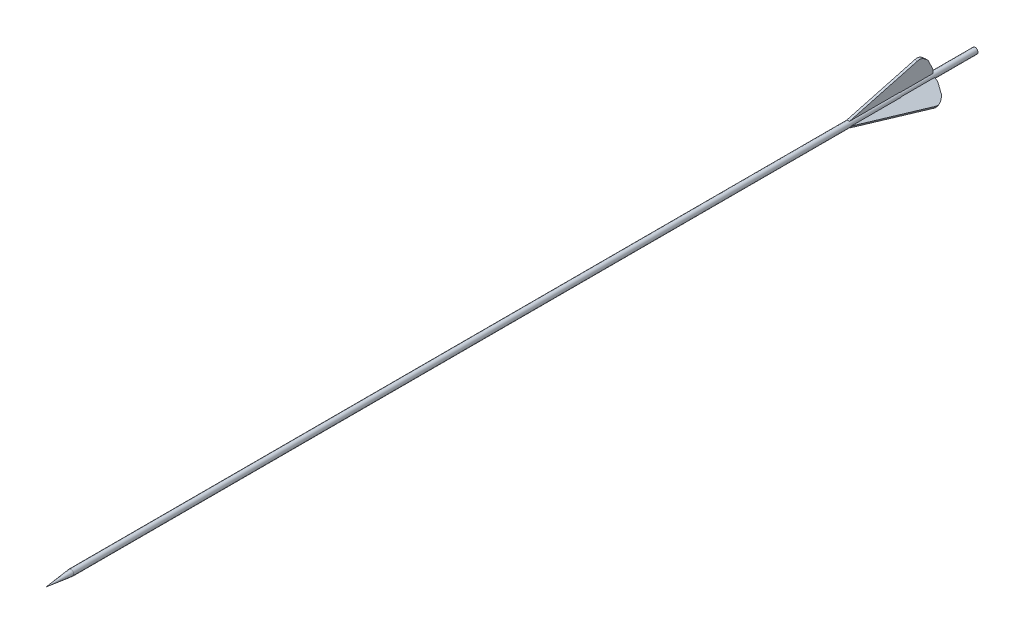
ISO-10303-21;
HEADER;
FILE_DESCRIPTION(('STEP AP214'),'2;1');
FILE_NAME('part.step','',(''),(''),'','','');
FILE_SCHEMA(('AUTOMOTIVE_DESIGN { 1 0 10303 214 1 1 1 1 }'));
ENDSEC;
DATA;
#1=APPLICATION_CONTEXT('core data for automotive mechanical design processes');
#2=APPLICATION_PROTOCOL_DEFINITION('international standard','automotive_design',2000,#1);
#3=PRODUCT_CONTEXT('',#1,'mechanical');
#4=PRODUCT('Part','Part','',(#3));
#5=PRODUCT_RELATED_PRODUCT_CATEGORY('part','',(#4));
#6=PRODUCT_DEFINITION_FORMATION('','',#4);
#7=PRODUCT_DEFINITION_CONTEXT('part definition',#1,'design');
#8=PRODUCT_DEFINITION('design','',#6,#7);
#9=PRODUCT_DEFINITION_SHAPE('','',#8);
#10=(LENGTH_UNIT() NAMED_UNIT(*) SI_UNIT(.MILLI.,.METRE.));
#11=(NAMED_UNIT(*) PLANE_ANGLE_UNIT() SI_UNIT($,.RADIAN.));
#12=(NAMED_UNIT(*) SI_UNIT($,.STERADIAN.) SOLID_ANGLE_UNIT());
#13=UNCERTAINTY_MEASURE_WITH_UNIT(LENGTH_MEASURE(1.E-05),#10,'distance_accuracy_value','');
#14=(GEOMETRIC_REPRESENTATION_CONTEXT(3) GLOBAL_UNCERTAINTY_ASSIGNED_CONTEXT((#13)) GLOBAL_UNIT_ASSIGNED_CONTEXT((#10,
#11,#12)) REPRESENTATION_CONTEXT('',''));
#15=CARTESIAN_POINT('',(0.,0.,0.));
#16=DIRECTION('',(0.,0.,1.));
#17=DIRECTION('',(1.,0.,0.));
#18=AXIS2_PLACEMENT_3D('',#15,#16,#17);
#19=CARTESIAN_POINT('',(1.435739982539,-1.98362540378443,-265.851898490184));
#20=DIRECTION('',(-0.836516303737814,0.482962913144527,-0.258819045102514));
#21=DIRECTION('',(0.224143868042009,-0.129409522551255,-0.96592582628907));
#22=AXIS2_PLACEMENT_3D('',#19,#20,#21);
#23=PLANE('',#22);
#24=DIRECTION('',(-0.224143868042009,0.129409522551255,0.96592582628907));
#25=VECTOR('',#24,1.);
#26=CARTESIAN_POINT('',(2.43573998253898,-0.251574596215539,-265.851898490184));
#27=LINE('',#26,#25);
#28=CARTESIAN_POINT('',(14.8705869414842,-7.43083683529418,-319.438641364391));
#29=VERTEX_POINT('',#28);
#30=CARTESIAN_POINT('',(2.43573998253898,-0.251574596215539,-265.851898490184));
#31=VERTEX_POINT('',#30);
#32=EDGE_CURVE('E131',#29,#31,#27,.T.);
#33=ORIENTED_EDGE('',*,*,#32,.T.);
#34=DIRECTION('',(0.499999999999992,0.866025403784443,0.));
#35=VECTOR('',#34,1.);
#36=CARTESIAN_POINT('',(1.435739982539,-1.98362540378443,-265.851898490184));
#37=LINE('',#36,#35);
#38=CARTESIAN_POINT('',(1.435739982539,-1.98362540378443,-265.851898490184));
#39=VERTEX_POINT('',#38);
#40=EDGE_CURVE('E12',#39,#31,#37,.T.);
#41=ORIENTED_EDGE('',*,*,#40,.F.);
#42=DIRECTION('',(-0.224143868042009,0.129409522551255,0.96592582628907));
#43=VECTOR('',#42,1.);
#44=CARTESIAN_POINT('',(1.435739982539,-1.98362540378443,-265.851898490184));
#45=LINE('',#44,#43);
#46=CARTESIAN_POINT('',(13.8705869414842,-9.16288764286307,-319.438641364391));
#47=VERTEX_POINT('',#46);
#48=EDGE_CURVE('E99',#47,#39,#45,.T.);
#49=ORIENTED_EDGE('',*,*,#48,.F.);
#50=DIRECTION('',(0.499999999999992,0.866025403784443,0.));
#51=VECTOR('',#50,1.);
#52=CARTESIAN_POINT('',(13.8705869414842,-9.16288764286307,-319.438641364391));
#53=LINE('',#52,#51);
#54=EDGE_CURVE('E107',#47,#29,#53,.T.);
#55=ORIENTED_EDGE('',*,*,#54,.T.);
#56=EDGE_LOOP('',(#33,#41,#49,#55));
#57=FACE_BOUND('',#56,.T.);
#58=ADVANCED_FACE('F48',(#57),#23,.F.);
#59=CARTESIAN_POINT('',(1.435739982539,-1.98362540378443,-304.595078033719));
#60=DIRECTION('',(0.866025403784443,-0.499999999999992,0.));
#61=DIRECTION('',(0.,0.,1.));
#62=AXIS2_PLACEMENT_3D('',#59,#60,#61);
#63=PLANE('',#62);
#64=DIRECTION('',(0.,0.,-1.));
#65=VECTOR('',#64,1.);
#66=CARTESIAN_POINT('',(2.43573998253898,-0.251574596215539,-304.595078033719));
#67=LINE('',#66,#65);
#68=CARTESIAN_POINT('',(2.43573998253898,-0.251574596215539,-304.595078033719));
#69=VERTEX_POINT('',#68);
#70=EDGE_CURVE('E103',#31,#69,#67,.T.);
#71=ORIENTED_EDGE('',*,*,#70,.T.);
#72=DIRECTION('',(0.499999999999992,0.866025403784443,0.));
#73=VECTOR('',#72,1.);
#74=CARTESIAN_POINT('',(1.435739982539,-1.98362540378443,-304.595078033719));
#75=LINE('',#74,#73);
#76=CARTESIAN_POINT('',(1.435739982539,-1.98362540378443,-304.595078033719));
#77=VERTEX_POINT('',#76);
#78=EDGE_CURVE('E56',#77,#69,#75,.T.);
#79=ORIENTED_EDGE('',*,*,#78,.F.);
#80=DIRECTION('',(0.,0.,-1.));
#81=VECTOR('',#80,1.);
#82=CARTESIAN_POINT('',(1.435739982539,-1.98362540378443,-304.595078033719));
#83=LINE('',#82,#81);
#84=EDGE_CURVE('E94',#39,#77,#83,.T.);
#85=ORIENTED_EDGE('',*,*,#84,.F.);
#86=ORIENTED_EDGE('',*,*,#40,.T.);
#87=EDGE_LOOP('',(#71,#79,#85,#86));
#88=FACE_BOUND('',#87,.T.);
#89=ADVANCED_FACE('F102',(#88),#63,.F.);
#90=CARTESIAN_POINT('',(1.435739982539,-1.98362540378443,-304.595078033719));
#91=CARTESIAN_POINT('',(-0.435244171583323,-0.903412198752403,-317.618960327838));
#92=CARTESIAN_POINT('',(-3.70285376285361,0.98314307837406,-336.834434554968));
#93=CARTESIAN_POINT('',(11.5102699142412,-7.80015797181151,-326.789941802017));
#94=CARTESIAN_POINT('',(9.79163328500009,-6.80790265128003,-329.183734976983));
#95=CARTESIAN_POINT('',(12.8891765999051,-8.59627011796695,-324.768164308936));
#96=B_SPLINE_CURVE_WITH_KNOTS('',3,(#90,#91,#92,#93,#94,#95),.UNSPECIFIED.,.F.,.F.,(4,1,1,4),
(0.,0.505374178056224,0.593785367664236,0.884111896080116),.UNSPECIFIED.);
#97=DIRECTION('',(0.499999999999992,0.866025403784443,0.));
#98=VECTOR('',#97,1.);
#99=SURFACE_OF_LINEAR_EXTRUSION('',#96,#98);
#100=CARTESIAN_POINT('',(2.43573998253898,-0.251574596215539,-304.595078033719));
#101=CARTESIAN_POINT('',(0.564755828416661,0.828638608816483,-317.618960327838));
#102=CARTESIAN_POINT('',(-2.70285376285363,2.71519388594295,-336.834434554968));
#103=CARTESIAN_POINT('',(12.5102699142412,-6.06810716424262,-326.789941802017));
#104=CARTESIAN_POINT('',(10.7916332850001,-5.07585184371114,-329.183734976983));
#105=CARTESIAN_POINT('',(13.8891765999051,-6.86421931039806,-324.768164308936));
#106=B_SPLINE_CURVE_WITH_KNOTS('',3,(#100,#101,#102,#103,#104,#105),.UNSPECIFIED.,.F.,.F.,(4,1,
1,4),(0.,0.505374178056224,0.593785367664236,0.884111896080116),.UNSPECIFIED.);
#107=CARTESIAN_POINT('',(13.8891765999051,-6.86421931039806,-324.768164308936));
#108=VERTEX_POINT('',#107);
#109=EDGE_CURVE('E81',#69,#108,#106,.T.);
#110=ORIENTED_EDGE('',*,*,#109,.T.);
#111=DIRECTION('',(0.499999999999992,0.866025403784443,0.));
#112=VECTOR('',#111,1.);
#113=CARTESIAN_POINT('',(12.8891765999051,-8.59627011796695,-324.768164308936));
#114=LINE('',#113,#112);
#115=CARTESIAN_POINT('',(12.8891765999051,-8.59627011796695,-324.768164308936));
#116=VERTEX_POINT('',#115);
#117=EDGE_CURVE('E104',#116,#108,#114,.T.);
#118=ORIENTED_EDGE('',*,*,#117,.F.);
#119=EDGE_CURVE('E97',#77,#116,#96,.T.);
#120=ORIENTED_EDGE('',*,*,#119,.F.);
#121=ORIENTED_EDGE('',*,*,#78,.T.);
#122=EDGE_LOOP('',(#110,#118,#120,#121));
#123=FACE_BOUND('',#122,.T.);
#124=ADVANCED_FACE('F105',(#123),#99,.F.);
#125=CARTESIAN_POINT('',(8.85148911905731,-6.26511016399592,-320.991555635006));
#126=DIRECTION('',(0.499999999999992,0.866025403784443,0.));
#127=DIRECTION('',(0.,0.,1.));
#128=AXIS2_PLACEMENT_3D('',#125,#126,#127);
#129=CYLINDRICAL_SURFACE('',#128,5.99999999999999);
#130=CARTESIAN_POINT('',(9.85148911905729,-4.53305935642703,-320.991555635006));
#131=DIRECTION('',(-0.499999999999992,-0.866025403784443,0.));
#132=DIRECTION('',(0.,0.,-1.));
#133=AXIS2_PLACEMENT_3D('',#130,#131,#132);
#134=CIRCLE('',#133,5.99999999999999);
#135=EDGE_CURVE('E87',#108,#29,#134,.T.);
#136=ORIENTED_EDGE('',*,*,#135,.T.);
#137=ORIENTED_EDGE('',*,*,#54,.F.);
#138=CARTESIAN_POINT('',(8.85148911905731,-6.26511016399592,-320.991555635006));
#139=DIRECTION('',(-0.499999999999992,-0.866025403784443,0.));
#140=DIRECTION('',(0.,0.,-1.));
#141=AXIS2_PLACEMENT_3D('',#138,#139,#140);
#142=CIRCLE('',#141,5.99999999999999);
#143=EDGE_CURVE('E64',#116,#47,#142,.T.);
#144=ORIENTED_EDGE('',*,*,#143,.F.);
#145=ORIENTED_EDGE('',*,*,#117,.T.);
#146=EDGE_LOOP('',(#136,#137,#144,#145));
#147=FACE_BOUND('',#146,.T.);
#148=ADVANCED_FACE('F120',(#147),#129,.T.);
#149=CARTESIAN_POINT('',(8.85148911905731,-6.26511016399592,-320.991555635006));
#150=DIRECTION('',(-0.499999999999992,-0.866025403784443,0.));
#151=DIRECTION('',(0.,0.,-1.));
#152=AXIS2_PLACEMENT_3D('',#149,#150,#151);
#153=PLANE('',#152);
#154=ORIENTED_EDGE('',*,*,#48,.T.);
#155=ORIENTED_EDGE('',*,*,#84,.T.);
#156=ORIENTED_EDGE('',*,*,#119,.T.);
#157=ORIENTED_EDGE('',*,*,#143,.T.);
#158=EDGE_LOOP('',(#154,#155,#156,#157));
#159=FACE_BOUND('',#158,.T.);
#160=ADVANCED_FACE('F95',(#159),#153,.T.);
#161=CARTESIAN_POINT('',(9.85148911905729,-4.53305935642703,-320.991555635006));
#162=DIRECTION('',(-0.499999999999992,-0.866025403784443,0.));
#163=DIRECTION('',(0.,0.,-1.));
#164=AXIS2_PLACEMENT_3D('',#161,#162,#163);
#165=PLANE('',#164);
#166=ORIENTED_EDGE('',*,*,#32,.F.);
#167=ORIENTED_EDGE('',*,*,#135,.F.);
#168=ORIENTED_EDGE('',*,*,#109,.F.);
#169=ORIENTED_EDGE('',*,*,#70,.F.);
#170=EDGE_LOOP('',(#166,#167,#168,#169));
#171=FACE_BOUND('',#170,.T.);
#172=ADVANCED_FACE('F143',(#171),#165,.F.);
#173=CLOSED_SHELL('',(#58,#89,#124,#148,#160,#172));
#174=MANIFOLD_SOLID_BREP('B2',#173);
#175=CARTESIAN_POINT('',(-2.43573998253898,-0.251574596215572,-265.851898490184));
#176=DIRECTION('',(0.836516303737807,0.482962913144539,-0.258819045102514));
#177=DIRECTION('',(-0.224143868042007,-0.129409522551258,-0.96592582628907));
#178=AXIS2_PLACEMENT_3D('',#175,#176,#177);
#179=PLANE('',#178);
#180=DIRECTION('',(0.224143868042007,0.129409522551258,0.96592582628907));
#181=VECTOR('',#180,1.);
#182=CARTESIAN_POINT('',(-1.43573998253897,-1.98362540378445,-265.851898490184));
#183=LINE('',#182,#181);
#184=CARTESIAN_POINT('',(-13.8705869414841,-9.16288764286326,-319.438641364391));
#185=VERTEX_POINT('',#184);
#186=CARTESIAN_POINT('',(-1.43573998253897,-1.98362540378445,-265.851898490184));
#187=VERTEX_POINT('',#186);
#188=EDGE_CURVE('E288',#185,#187,#183,.T.);
#189=ORIENTED_EDGE('',*,*,#188,.T.);
#190=DIRECTION('',(0.500000000000004,-0.866025403784436,0.));
#191=VECTOR('',#190,1.);
#192=CARTESIAN_POINT('',(-2.43573998253898,-0.251574596215572,-265.851898490184));
#193=LINE('',#192,#191);
#194=CARTESIAN_POINT('',(-2.43573998253898,-0.251574596215572,-265.851898490184));
#195=VERTEX_POINT('',#194);
#196=EDGE_CURVE('E46',#195,#187,#193,.T.);
#197=ORIENTED_EDGE('',*,*,#196,.F.);
#198=DIRECTION('',(0.224143868042007,0.129409522551258,0.96592582628907));
#199=VECTOR('',#198,1.);
#200=CARTESIAN_POINT('',(-2.43573998253898,-0.251574596215572,-265.851898490184));
#201=LINE('',#200,#199);
#202=CARTESIAN_POINT('',(-14.8705869414841,-7.43083683529439,-319.438641364391));
#203=VERTEX_POINT('',#202);
#204=EDGE_CURVE('E256',#203,#195,#201,.T.);
#205=ORIENTED_EDGE('',*,*,#204,.F.);
#206=DIRECTION('',(0.500000000000004,-0.866025403784436,0.));
#207=VECTOR('',#206,1.);
#208=CARTESIAN_POINT('',(-14.8705869414841,-7.43083683529439,-319.438641364391));
#209=LINE('',#208,#207);
#210=EDGE_CURVE('E264',#203,#185,#209,.T.);
#211=ORIENTED_EDGE('',*,*,#210,.T.);
#212=EDGE_LOOP('',(#189,#197,#205,#211));
#213=FACE_BOUND('',#212,.T.);
#214=ADVANCED_FACE('F205',(#213),#179,.F.);
#215=CARTESIAN_POINT('',(-2.43573998253898,-0.251574596215572,-304.595078033719));
#216=DIRECTION('',(-0.866025403784436,-0.500000000000004,0.));
#217=DIRECTION('',(0.,0.,1.));
#218=AXIS2_PLACEMENT_3D('',#215,#216,#217);
#219=PLANE('',#218);
#220=DIRECTION('',(0.,0.,-1.));
#221=VECTOR('',#220,1.);
#222=CARTESIAN_POINT('',(-1.43573998253897,-1.98362540378445,-304.595078033719));
#223=LINE('',#222,#221);
#224=CARTESIAN_POINT('',(-1.43573998253897,-1.98362540378445,-304.595078033719));
#225=VERTEX_POINT('',#224);
#226=EDGE_CURVE('E260',#187,#225,#223,.T.);
#227=ORIENTED_EDGE('',*,*,#226,.T.);
#228=DIRECTION('',(0.500000000000004,-0.866025403784436,0.));
#229=VECTOR('',#228,1.);
#230=CARTESIAN_POINT('',(-2.43573998253898,-0.251574596215572,-304.595078033719));
#231=LINE('',#230,#229);
#232=CARTESIAN_POINT('',(-2.43573998253898,-0.251574596215572,-304.595078033719));
#233=VERTEX_POINT('',#232);
#234=EDGE_CURVE('E213',#233,#225,#231,.T.);
#235=ORIENTED_EDGE('',*,*,#234,.F.);
#236=DIRECTION('',(0.,0.,-1.));
#237=VECTOR('',#236,1.);
#238=CARTESIAN_POINT('',(-2.43573998253898,-0.251574596215572,-304.595078033719));
#239=LINE('',#238,#237);
#240=EDGE_CURVE('E251',#195,#233,#239,.T.);
#241=ORIENTED_EDGE('',*,*,#240,.F.);
#242=ORIENTED_EDGE('',*,*,#196,.T.);
#243=EDGE_LOOP('',(#227,#235,#241,#242));
#244=FACE_BOUND('',#243,.T.);
#245=ADVANCED_FACE('F259',(#244),#219,.F.);
#246=CARTESIAN_POINT('',(-2.43573998253898,-0.251574596215572,-304.595078033719));
#247=CARTESIAN_POINT('',(-0.564755828416672,0.828638608816475,-317.618960327838));
#248=CARTESIAN_POINT('',(2.70285376285359,2.71519388594298,-336.834434554968));
#249=CARTESIAN_POINT('',(-12.5102699142411,-6.0681071642428,-326.789941802017));
#250=CARTESIAN_POINT('',(-10.791633285,-5.07585184371129,-329.183734976983));
#251=CARTESIAN_POINT('',(-13.889176599905,-6.86421931039825,-324.768164308936));
#252=B_SPLINE_CURVE_WITH_KNOTS('',3,(#246,#247,#248,#249,#250,#251),.UNSPECIFIED.,.F.,.F.,(4,1,
1,4),(0.,0.505374178056224,0.593785367664236,0.884111896080116),.UNSPECIFIED.);
#253=DIRECTION('',(0.500000000000004,-0.866025403784436,0.));
#254=VECTOR('',#253,1.);
#255=SURFACE_OF_LINEAR_EXTRUSION('',#252,#254);
#256=CARTESIAN_POINT('',(-1.43573998253897,-1.98362540378445,-304.595078033719));
#257=CARTESIAN_POINT('',(0.435244171583336,-0.903412198752398,-317.618960327838));
#258=CARTESIAN_POINT('',(3.7028537628536,0.983143078374111,-336.834434554968));
#259=CARTESIAN_POINT('',(-11.5102699142411,-7.80015797181167,-326.789941802017));
#260=CARTESIAN_POINT('',(-9.791633285,-6.80790265128016,-329.183734976983));
#261=CARTESIAN_POINT('',(-12.889176599905,-8.59627011796712,-324.768164308936));
#262=B_SPLINE_CURVE_WITH_KNOTS('',3,(#256,#257,#258,#259,#260,#261),.UNSPECIFIED.,.F.,.F.,(4,1,
1,4),(0.,0.505374178056224,0.593785367664236,0.884111896080116),.UNSPECIFIED.);
#263=CARTESIAN_POINT('',(-12.889176599905,-8.59627011796712,-324.768164308936));
#264=VERTEX_POINT('',#263);
#265=EDGE_CURVE('E238',#225,#264,#262,.T.);
#266=ORIENTED_EDGE('',*,*,#265,.T.);
#267=DIRECTION('',(0.500000000000004,-0.866025403784436,0.));
#268=VECTOR('',#267,1.);
#269=CARTESIAN_POINT('',(-13.889176599905,-6.86421931039825,-324.768164308936));
#270=LINE('',#269,#268);
#271=CARTESIAN_POINT('',(-13.889176599905,-6.86421931039825,-324.768164308936));
#272=VERTEX_POINT('',#271);
#273=EDGE_CURVE('E261',#272,#264,#270,.T.);
#274=ORIENTED_EDGE('',*,*,#273,.F.);
#275=EDGE_CURVE('E254',#233,#272,#252,.T.);
#276=ORIENTED_EDGE('',*,*,#275,.F.);
#277=ORIENTED_EDGE('',*,*,#234,.T.);
#278=EDGE_LOOP('',(#266,#274,#276,#277));
#279=FACE_BOUND('',#278,.T.);
#280=ADVANCED_FACE('F262',(#279),#255,.F.);
#281=CARTESIAN_POINT('',(-9.85148911905723,-4.53305935642717,-320.991555635006));
#282=DIRECTION('',(0.500000000000004,-0.866025403784436,0.));
#283=DIRECTION('',(0.,0.,1.));
#284=AXIS2_PLACEMENT_3D('',#281,#282,#283);
#285=CYLINDRICAL_SURFACE('',#284,5.99999999999999);
#286=CARTESIAN_POINT('',(-8.85148911905723,-6.26511016399604,-320.991555635006));
#287=DIRECTION('',(-0.500000000000004,0.866025403784436,0.));
#288=DIRECTION('',(0.,0.,-1.));
#289=AXIS2_PLACEMENT_3D('',#286,#287,#288);
#290=CIRCLE('',#289,5.99999999999999);
#291=EDGE_CURVE('E244',#264,#185,#290,.T.);
#292=ORIENTED_EDGE('',*,*,#291,.T.);
#293=ORIENTED_EDGE('',*,*,#210,.F.);
#294=CARTESIAN_POINT('',(-9.85148911905723,-4.53305935642717,-320.991555635006));
#295=DIRECTION('',(-0.500000000000004,0.866025403784436,0.));
#296=DIRECTION('',(0.,0.,-1.));
#297=AXIS2_PLACEMENT_3D('',#294,#295,#296);
#298=CIRCLE('',#297,5.99999999999999);
#299=EDGE_CURVE('E221',#272,#203,#298,.T.);
#300=ORIENTED_EDGE('',*,*,#299,.F.);
#301=ORIENTED_EDGE('',*,*,#273,.T.);
#302=EDGE_LOOP('',(#292,#293,#300,#301));
#303=FACE_BOUND('',#302,.T.);
#304=ADVANCED_FACE('F277',(#303),#285,.T.);
#305=CARTESIAN_POINT('',(-9.85148911905723,-4.53305935642717,-320.991555635006));
#306=DIRECTION('',(-0.500000000000004,0.866025403784436,0.));
#307=DIRECTION('',(0.,0.,-1.));
#308=AXIS2_PLACEMENT_3D('',#305,#306,#307);
#309=PLANE('',#308);
#310=ORIENTED_EDGE('',*,*,#204,.T.);
#311=ORIENTED_EDGE('',*,*,#240,.T.);
#312=ORIENTED_EDGE('',*,*,#275,.T.);
#313=ORIENTED_EDGE('',*,*,#299,.T.);
#314=EDGE_LOOP('',(#310,#311,#312,#313));
#315=FACE_BOUND('',#314,.T.);
#316=ADVANCED_FACE('F252',(#315),#309,.T.);
#317=CARTESIAN_POINT('',(-8.85148911905723,-6.26511016399604,-320.991555635006));
#318=DIRECTION('',(-0.500000000000004,0.866025403784436,0.));
#319=DIRECTION('',(0.,0.,-1.));
#320=AXIS2_PLACEMENT_3D('',#317,#318,#319);
#321=PLANE('',#320);
#322=ORIENTED_EDGE('',*,*,#188,.F.);
#323=ORIENTED_EDGE('',*,*,#291,.F.);
#324=ORIENTED_EDGE('',*,*,#265,.F.);
#325=ORIENTED_EDGE('',*,*,#226,.F.);
#326=EDGE_LOOP('',(#322,#323,#324,#325));
#327=FACE_BOUND('',#326,.T.);
#328=ADVANCED_FACE('F300',(#327),#321,.F.);
#329=CLOSED_SHELL('',(#214,#245,#280,#304,#316,#328));
#330=MANIFOLD_SOLID_BREP('B6',#329);
#331=CARTESIAN_POINT('',(1.,2.2352,-265.851898490184));
#332=DIRECTION('',(0.,-0.96592582628907,-0.258819045102514));
#333=DIRECTION('',(0.,0.258819045102514,-0.96592582628907));
#334=AXIS2_PLACEMENT_3D('',#331,#332,#333);
#335=PLANE('',#334);
#336=DIRECTION('',(0.,-0.258819045102514,0.96592582628907));
#337=VECTOR('',#336,1.);
#338=CARTESIAN_POINT('',(-1.,2.2352,-265.851898490184));
#339=LINE('',#338,#337);
#340=CARTESIAN_POINT('',(-1.,16.5937244781575,-319.438641364391));
#341=VERTEX_POINT('',#340);
#342=CARTESIAN_POINT('',(-1.,2.2352,-265.851898490184));
#343=VERTEX_POINT('',#342);
#344=EDGE_CURVE('E444',#341,#343,#339,.T.);
#345=ORIENTED_EDGE('',*,*,#344,.T.);
#346=DIRECTION('',(-1.,0.,0.));
#347=VECTOR('',#346,1.);
#348=CARTESIAN_POINT('',(1.,2.2352,-265.851898490184));
#349=LINE('',#348,#347);
#350=CARTESIAN_POINT('',(1.,2.2352,-265.851898490184));
#351=VERTEX_POINT('',#350);
#352=EDGE_CURVE('E203',#351,#343,#349,.T.);
#353=ORIENTED_EDGE('',*,*,#352,.F.);
#354=DIRECTION('',(0.,-0.258819045102514,0.96592582628907));
#355=VECTOR('',#354,1.);
#356=CARTESIAN_POINT('',(1.,2.2352,-265.851898490184));
#357=LINE('',#356,#355);
#358=CARTESIAN_POINT('',(1.,16.5937244781575,-319.438641364391));
#359=VERTEX_POINT('',#358);
#360=EDGE_CURVE('E412',#359,#351,#357,.T.);
#361=ORIENTED_EDGE('',*,*,#360,.F.);
#362=DIRECTION('',(-1.,0.,0.));
#363=VECTOR('',#362,1.);
#364=CARTESIAN_POINT('',(1.,16.5937244781575,-319.438641364391));
#365=LINE('',#364,#363);
#366=EDGE_CURVE('E420',#359,#341,#365,.T.);
#367=ORIENTED_EDGE('',*,*,#366,.T.);
#368=EDGE_LOOP('',(#345,#353,#361,#367));
#369=FACE_BOUND('',#368,.T.);
#370=ADVANCED_FACE('F361',(#369),#335,.F.);
#371=CARTESIAN_POINT('',(1.,2.2352,-304.595078033719));
#372=DIRECTION('',(0.,1.,0.));
#373=DIRECTION('',(0.,0.,1.));
#374=AXIS2_PLACEMENT_3D('',#371,#372,#373);
#375=PLANE('',#374);
#376=DIRECTION('',(0.,0.,-1.));
#377=VECTOR('',#376,1.);
#378=CARTESIAN_POINT('',(-1.,2.2352,-304.595078033719));
#379=LINE('',#378,#377);
#380=CARTESIAN_POINT('',(-1.,2.2352,-304.595078033719));
#381=VERTEX_POINT('',#380);
#382=EDGE_CURVE('E416',#343,#381,#379,.T.);
#383=ORIENTED_EDGE('',*,*,#382,.T.);
#384=DIRECTION('',(-1.,0.,0.));
#385=VECTOR('',#384,1.);
#386=CARTESIAN_POINT('',(1.,2.2352,-304.595078033719));
#387=LINE('',#386,#385);
#388=CARTESIAN_POINT('',(1.,2.2352,-304.595078033719));
#389=VERTEX_POINT('',#388);
#390=EDGE_CURVE('E369',#389,#381,#387,.T.);
#391=ORIENTED_EDGE('',*,*,#390,.F.);
#392=DIRECTION('',(0.,0.,-1.));
#393=VECTOR('',#392,1.);
#394=CARTESIAN_POINT('',(1.,2.2352,-304.595078033719));
#395=LINE('',#394,#393);
#396=EDGE_CURVE('E407',#351,#389,#395,.T.);
#397=ORIENTED_EDGE('',*,*,#396,.F.);
#398=ORIENTED_EDGE('',*,*,#352,.T.);
#399=EDGE_LOOP('',(#383,#391,#397,#398));
#400=FACE_BOUND('',#399,.T.);
#401=ADVANCED_FACE('F415',(#400),#375,.F.);
#402=CARTESIAN_POINT('',(1.,2.2352,-304.595078033719));
#403=CARTESIAN_POINT('',(1.,0.0747735899359216,-317.618960327838));
#404=CARTESIAN_POINT('',(1.,-3.69833696431707,-336.834434554968));
#405=CARTESIAN_POINT('',(1.,13.8682651360544,-326.789941802017));
#406=CARTESIAN_POINT('',(1.,11.8837544949914,-329.183734976983));
#407=CARTESIAN_POINT('',(1.,15.4604894283652,-324.768164308936));
#408=B_SPLINE_CURVE_WITH_KNOTS('',3,(#402,#403,#404,#405,#406,#407),.UNSPECIFIED.,.F.,.F.,(4,1,
1,4),(0.,0.505374178056224,0.593785367664236,0.884111896080116),.UNSPECIFIED.);
#409=DIRECTION('',(-1.,0.,0.));
#410=VECTOR('',#409,1.);
#411=SURFACE_OF_LINEAR_EXTRUSION('',#408,#410);
#412=CARTESIAN_POINT('',(-1.,2.2352,-304.595078033719));
#413=CARTESIAN_POINT('',(-1.,0.0747735899359216,-317.618960327838));
#414=CARTESIAN_POINT('',(-1.,-3.69833696431707,-336.834434554968));
#415=CARTESIAN_POINT('',(-1.,13.8682651360544,-326.789941802017));
#416=CARTESIAN_POINT('',(-1.,11.8837544949914,-329.183734976983));
#417=CARTESIAN_POINT('',(-1.,15.4604894283652,-324.768164308936));
#418=B_SPLINE_CURVE_WITH_KNOTS('',3,(#412,#413,#414,#415,#416,#417),.UNSPECIFIED.,.F.,.F.,(4,1,
1,4),(0.,0.505374178056224,0.593785367664236,0.884111896080116),.UNSPECIFIED.);
#419=CARTESIAN_POINT('',(-1.,15.4604894283652,-324.768164308936));
#420=VERTEX_POINT('',#419);
#421=EDGE_CURVE('E394',#381,#420,#418,.T.);
#422=ORIENTED_EDGE('',*,*,#421,.T.);
#423=DIRECTION('',(-1.,0.,0.));
#424=VECTOR('',#423,1.);
#425=CARTESIAN_POINT('',(1.,15.4604894283652,-324.768164308936));
#426=LINE('',#425,#424);
#427=CARTESIAN_POINT('',(1.,15.4604894283652,-324.768164308936));
#428=VERTEX_POINT('',#427);
#429=EDGE_CURVE('E417',#428,#420,#426,.T.);
#430=ORIENTED_EDGE('',*,*,#429,.F.);
#431=EDGE_CURVE('E410',#389,#428,#408,.T.);
#432=ORIENTED_EDGE('',*,*,#431,.F.);
#433=ORIENTED_EDGE('',*,*,#390,.T.);
#434=EDGE_LOOP('',(#422,#430,#432,#433));
#435=FACE_BOUND('',#434,.T.);
#436=ADVANCED_FACE('F418',(#435),#411,.F.);
#437=CARTESIAN_POINT('',(1.,10.7981695204231,-320.991555635006));
#438=DIRECTION('',(-1.,0.,0.));
#439=DIRECTION('',(0.,0.,1.));
#440=AXIS2_PLACEMENT_3D('',#437,#438,#439);
#441=CYLINDRICAL_SURFACE('',#440,5.99999999999999);
#442=CARTESIAN_POINT('',(-1.,10.7981695204231,-320.991555635006));
#443=DIRECTION('',(1.,0.,0.));
#444=DIRECTION('',(0.,0.,-1.));
#445=AXIS2_PLACEMENT_3D('',#442,#443,#444);
#446=CIRCLE('',#445,5.99999999999999);
#447=EDGE_CURVE('E400',#420,#341,#446,.T.);
#448=ORIENTED_EDGE('',*,*,#447,.T.);
#449=ORIENTED_EDGE('',*,*,#366,.F.);
#450=CARTESIAN_POINT('',(1.,10.7981695204231,-320.991555635006));
#451=DIRECTION('',(1.,0.,0.));
#452=DIRECTION('',(0.,0.,-1.));
#453=AXIS2_PLACEMENT_3D('',#450,#451,#452);
#454=CIRCLE('',#453,5.99999999999999);
#455=EDGE_CURVE('E377',#428,#359,#454,.T.);
#456=ORIENTED_EDGE('',*,*,#455,.F.);
#457=ORIENTED_EDGE('',*,*,#429,.T.);
#458=EDGE_LOOP('',(#448,#449,#456,#457));
#459=FACE_BOUND('',#458,.T.);
#460=ADVANCED_FACE('F433',(#459),#441,.T.);
#461=CARTESIAN_POINT('',(1.,10.7981695204231,-320.991555635006));
#462=DIRECTION('',(1.,0.,0.));
#463=DIRECTION('',(0.,0.,-1.));
#464=AXIS2_PLACEMENT_3D('',#461,#462,#463);
#465=PLANE('',#464);
#466=ORIENTED_EDGE('',*,*,#360,.T.);
#467=ORIENTED_EDGE('',*,*,#396,.T.);
#468=ORIENTED_EDGE('',*,*,#431,.T.);
#469=ORIENTED_EDGE('',*,*,#455,.T.);
#470=EDGE_LOOP('',(#466,#467,#468,#469));
#471=FACE_BOUND('',#470,.T.);
#472=ADVANCED_FACE('F408',(#471),#465,.T.);
#473=CARTESIAN_POINT('',(-1.,10.7981695204231,-320.991555635006));
#474=DIRECTION('',(1.,0.,0.));
#475=DIRECTION('',(0.,0.,-1.));
#476=AXIS2_PLACEMENT_3D('',#473,#474,#475);
#477=PLANE('',#476);
#478=ORIENTED_EDGE('',*,*,#344,.F.);
#479=ORIENTED_EDGE('',*,*,#447,.F.);
#480=ORIENTED_EDGE('',*,*,#421,.F.);
#481=ORIENTED_EDGE('',*,*,#382,.F.);
#482=EDGE_LOOP('',(#478,#479,#480,#481));
#483=FACE_BOUND('',#482,.T.);
#484=ADVANCED_FACE('F456',(#483),#477,.F.);
#485=CLOSED_SHELL('',(#370,#401,#436,#460,#472,#484));
#486=MANIFOLD_SOLID_BREP('B40',#485);
#487=CARTESIAN_POINT('',(0.,0.,346.125224176229));
#488=DIRECTION('',(0.,0.,-1.));
#489=DIRECTION('',(0.,1.,0.));
#490=AXIS2_PLACEMENT_3D('',#487,#488,#489);
#491=CONICAL_SURFACE('',#490,2.2352,0.113423153121119);
#492=CARTESIAN_POINT('',(0.,0.,365.747378609352));
#493=VERTEX_POINT('',#492);
#494=VERTEX_LOOP('',#493);
#495=FACE_BOUND('',#494,.T.);
#496=CARTESIAN_POINT('',(0.,0.,346.125224176229));
#497=DIRECTION('',(0.,0.,1.));
#498=DIRECTION('',(0.,-1.,0.));
#499=AXIS2_PLACEMENT_3D('',#496,#497,#498);
#500=CIRCLE('',#499,2.2352);
#501=CARTESIAN_POINT('',(0.,-2.2352,346.125224176229));
#502=VERTEX_POINT('',#501);
#503=EDGE_CURVE('E359',#502,#502,#500,.T.);
#504=ORIENTED_EDGE('',*,*,#503,.T.);
#505=EDGE_LOOP('',(#504));
#506=FACE_BOUND('',#505,.T.);
#507=ADVANCED_FACE('F496',(#495,#506),#491,.T.);
#508=CARTESIAN_POINT('',(0.,0.,365.747378609352));
#509=DIRECTION('',(0.,0.,1.));
#510=DIRECTION('',(0.,-1.,0.));
#511=AXIS2_PLACEMENT_3D('',#508,#509,#510);
#512=CYLINDRICAL_SURFACE('',#511,2.2352);
#513=ORIENTED_EDGE('',*,*,#503,.F.);
#514=EDGE_LOOP('',(#513));
#515=FACE_BOUND('',#514,.T.);
#516=CARTESIAN_POINT('',(0.,0.,-365.851898490184));
#517=DIRECTION('',(0.,0.,1.));
#518=DIRECTION('',(0.,-1.,0.));
#519=AXIS2_PLACEMENT_3D('',#516,#517,#518);
#520=CIRCLE('',#519,2.2352);
#521=CARTESIAN_POINT('',(0.,-2.2352,-365.851898490184));
#522=VERTEX_POINT('',#521);
#523=EDGE_CURVE('E503',#522,#522,#520,.T.);
#524=ORIENTED_EDGE('',*,*,#523,.T.);
#525=EDGE_LOOP('',(#524));
#526=FACE_BOUND('',#525,.T.);
#527=ADVANCED_FACE('F511',(#515,#526),#512,.T.);
#528=CARTESIAN_POINT('',(0.,0.,-365.747378609352));
#529=DIRECTION('',(0.,0.,-1.));
#530=DIRECTION('',(0.,1.,0.));
#531=AXIS2_PLACEMENT_3D('',#528,#529,#530);
#532=CONICAL_SURFACE('',#531,0.,1.52406950131203);
#533=ORIENTED_EDGE('',*,*,#523,.F.);
#534=EDGE_LOOP('',(#533));
#535=FACE_BOUND('',#534,.T.);
#536=CARTESIAN_POINT('',(0.,0.,-365.747378609352));
#537=VERTEX_POINT('',#536);
#538=VERTEX_LOOP('',#537);
#539=FACE_BOUND('',#538,.T.);
#540=ADVANCED_FACE('F516',(#535,#539),#532,.F.);
#541=CLOSED_SHELL('',(#507,#527,#540));
#542=MANIFOLD_SOLID_BREP('B197',#541);
#543=ADVANCED_BREP_SHAPE_REPRESENTATION('',(#18,#174,#330,#486,#542),#14);
#544=SHAPE_DEFINITION_REPRESENTATION(#9,#543);
ENDSEC;
END-ISO-10303-21;
